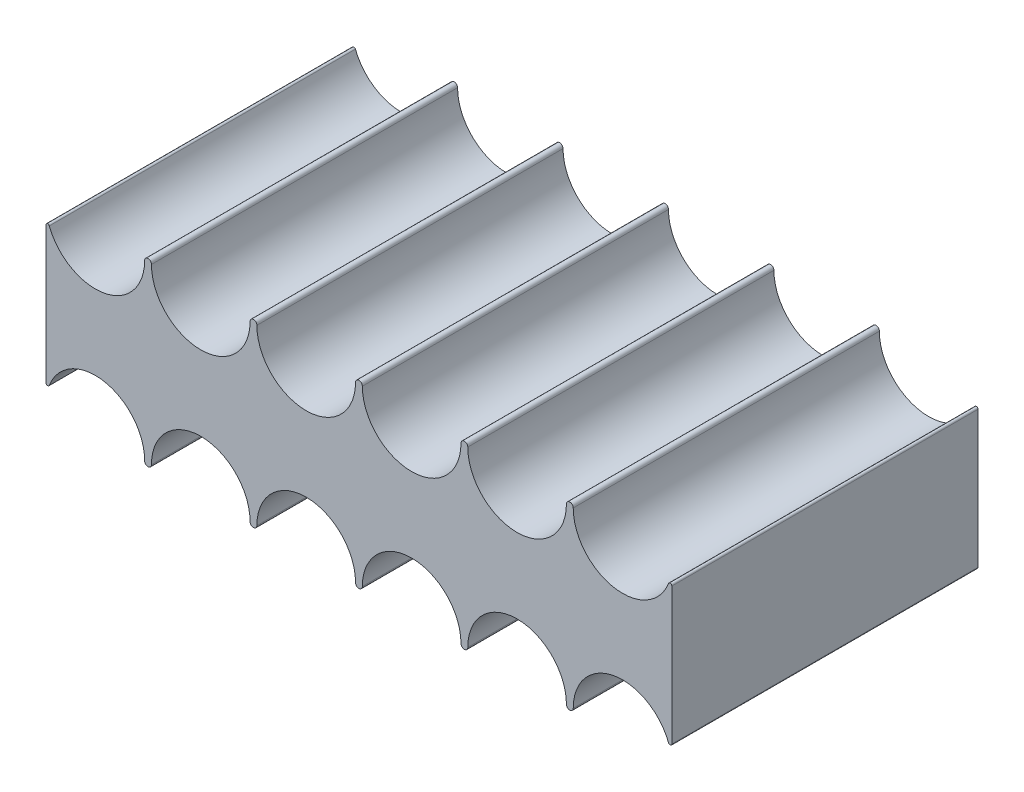
ISO-10303-21;
HEADER;
FILE_DESCRIPTION(('STEP AP214'),'2;1');
FILE_NAME('part.step','',(''),(''),'','','');
FILE_SCHEMA(('AUTOMOTIVE_DESIGN { 1 0 10303 214 1 1 1 1 }'));
ENDSEC;
DATA;
#1=APPLICATION_CONTEXT('core data for automotive mechanical design processes');
#2=APPLICATION_PROTOCOL_DEFINITION('international standard','automotive_design',2000,#1);
#3=PRODUCT_CONTEXT('',#1,'mechanical');
#4=PRODUCT('Part','Part','',(#3));
#5=PRODUCT_RELATED_PRODUCT_CATEGORY('part','',(#4));
#6=PRODUCT_DEFINITION_FORMATION('','',#4);
#7=PRODUCT_DEFINITION_CONTEXT('part definition',#1,'design');
#8=PRODUCT_DEFINITION('design','',#6,#7);
#9=PRODUCT_DEFINITION_SHAPE('','',#8);
#10=(LENGTH_UNIT() NAMED_UNIT(*) SI_UNIT(.MILLI.,.METRE.));
#11=(NAMED_UNIT(*) PLANE_ANGLE_UNIT() SI_UNIT($,.RADIAN.));
#12=(NAMED_UNIT(*) SI_UNIT($,.STERADIAN.) SOLID_ANGLE_UNIT());
#13=UNCERTAINTY_MEASURE_WITH_UNIT(LENGTH_MEASURE(1.E-05),#10,'distance_accuracy_value','');
#14=(GEOMETRIC_REPRESENTATION_CONTEXT(3) GLOBAL_UNCERTAINTY_ASSIGNED_CONTEXT((#13)) GLOBAL_UNIT_ASSIGNED_CONTEXT((#10,
#11,#12)) REPRESENTATION_CONTEXT('',''));
#15=CARTESIAN_POINT('',(0.,0.,0.));
#16=DIRECTION('',(0.,0.,1.));
#17=DIRECTION('',(1.,0.,0.));
#18=AXIS2_PLACEMENT_3D('',#15,#16,#17);
#19=CARTESIAN_POINT('',(-31.,12.75,45.));
#20=DIRECTION('',(0.,0.,-1.));
#21=DIRECTION('',(-1.,0.,0.));
#22=AXIS2_PLACEMENT_3D('',#19,#20,#21);
#23=CYLINDRICAL_SURFACE('',#22,0.5);
#24=CARTESIAN_POINT('',(-31.,12.75,0.));
#25=DIRECTION('',(0.,0.,1.));
#26=DIRECTION('',(-1.,0.,0.));
#27=AXIS2_PLACEMENT_3D('',#24,#25,#26);
#28=CIRCLE('',#27,0.5);
#29=CARTESIAN_POINT('',(-30.5,12.75,0.));
#30=VERTEX_POINT('',#29);
#31=CARTESIAN_POINT('',(-31.5,12.75,0.));
#32=VERTEX_POINT('',#31);
#33=EDGE_CURVE('E270',#30,#32,#28,.T.);
#34=ORIENTED_EDGE('',*,*,#33,.T.);
#35=DIRECTION('',(0.,0.,-1.));
#36=VECTOR('',#35,1.);
#37=CARTESIAN_POINT('',(-31.5,12.75,45.));
#38=LINE('',#37,#36);
#39=CARTESIAN_POINT('',(-31.5,12.75,45.));
#40=VERTEX_POINT('',#39);
#41=EDGE_CURVE('E11',#40,#32,#38,.T.);
#42=ORIENTED_EDGE('',*,*,#41,.F.);
#43=CARTESIAN_POINT('',(-31.,12.75,45.));
#44=DIRECTION('',(0.,0.,1.));
#45=DIRECTION('',(-1.,0.,0.));
#46=AXIS2_PLACEMENT_3D('',#43,#44,#45);
#47=CIRCLE('',#46,0.5);
#48=CARTESIAN_POINT('',(-30.5,12.75,45.));
#49=VERTEX_POINT('',#48);
#50=EDGE_CURVE('E352',#49,#40,#47,.T.);
#51=ORIENTED_EDGE('',*,*,#50,.F.);
#52=DIRECTION('',(0.,0.,-1.));
#53=VECTOR('',#52,1.);
#54=CARTESIAN_POINT('',(-30.5,12.75,45.));
#55=LINE('',#54,#53);
#56=EDGE_CURVE('E266',#49,#30,#55,.T.);
#57=ORIENTED_EDGE('',*,*,#56,.T.);
#58=EDGE_LOOP('',(#34,#42,#51,#57));
#59=FACE_BOUND('',#58,.T.);
#60=ADVANCED_FACE('F49',(#59),#23,.T.);
#61=CARTESIAN_POINT('',(-38.75,12.75,45.));
#62=DIRECTION('',(0.,0.,-1.));
#63=DIRECTION('',(-1.,0.,0.));
#64=AXIS2_PLACEMENT_3D('',#61,#62,#63);
#65=CYLINDRICAL_SURFACE('',#64,7.25);
#66=CARTESIAN_POINT('',(-38.75,12.75,0.));
#67=DIRECTION('',(0.,0.,-1.));
#68=DIRECTION('',(1.,0.,0.));
#69=AXIS2_PLACEMENT_3D('',#66,#67,#68);
#70=CIRCLE('',#69,7.25);
#71=CARTESIAN_POINT('',(-45.5166666666667,10.1471703432183,0.));
#72=VERTEX_POINT('',#71);
#73=EDGE_CURVE('E274',#32,#72,#70,.T.);
#74=ORIENTED_EDGE('',*,*,#73,.T.);
#75=DIRECTION('',(0.,0.,-1.));
#76=VECTOR('',#75,1.);
#77=CARTESIAN_POINT('',(-45.5166666666667,10.1471703432183,45.));
#78=LINE('',#77,#76);
#79=CARTESIAN_POINT('',(-45.5166666666667,10.1471703432183,45.));
#80=VERTEX_POINT('',#79);
#81=EDGE_CURVE('E58',#80,#72,#78,.T.);
#82=ORIENTED_EDGE('',*,*,#81,.F.);
#83=CARTESIAN_POINT('',(-38.75,12.75,45.));
#84=DIRECTION('',(0.,0.,-1.));
#85=DIRECTION('',(1.,0.,0.));
#86=AXIS2_PLACEMENT_3D('',#83,#84,#85);
#87=CIRCLE('',#86,7.25);
#88=EDGE_CURVE('E169',#40,#80,#87,.T.);
#89=ORIENTED_EDGE('',*,*,#88,.F.);
#90=ORIENTED_EDGE('',*,*,#41,.T.);
#91=EDGE_LOOP('',(#74,#82,#89,#90));
#92=FACE_BOUND('',#91,.T.);
#93=ADVANCED_FACE('F558',(#92),#65,.F.);
#94=CARTESIAN_POINT('',(-45.75,10.0574175964327,45.));
#95=DIRECTION('',(0.,0.,-1.));
#96=DIRECTION('',(-1.,0.,0.));
#97=AXIS2_PLACEMENT_3D('',#94,#95,#96);
#98=CYLINDRICAL_SURFACE('',#97,0.250000000000001);
#99=CARTESIAN_POINT('',(-45.75,10.0574175964327,0.));
#100=DIRECTION('',(0.,0.,1.));
#101=DIRECTION('',(1.,0.,0.));
#102=AXIS2_PLACEMENT_3D('',#99,#100,#101);
#103=CIRCLE('',#102,0.250000000000001);
#104=CARTESIAN_POINT('',(-46.,10.0574175964327,0.));
#105=VERTEX_POINT('',#104);
#106=EDGE_CURVE('E277',#72,#105,#103,.T.);
#107=ORIENTED_EDGE('',*,*,#106,.T.);
#108=DIRECTION('',(0.,0.,-1.));
#109=VECTOR('',#108,1.);
#110=CARTESIAN_POINT('',(-46.,10.0574175964327,45.));
#111=LINE('',#110,#109);
#112=CARTESIAN_POINT('',(-46.,10.0574175964327,45.));
#113=VERTEX_POINT('',#112);
#114=EDGE_CURVE('E443',#113,#105,#111,.T.);
#115=ORIENTED_EDGE('',*,*,#114,.F.);
#116=CARTESIAN_POINT('',(-45.75,10.0574175964327,45.));
#117=DIRECTION('',(0.,0.,1.));
#118=DIRECTION('',(1.,0.,0.));
#119=AXIS2_PLACEMENT_3D('',#116,#117,#118);
#120=CIRCLE('',#119,0.250000000000001);
#121=EDGE_CURVE('E453',#80,#113,#120,.T.);
#122=ORIENTED_EDGE('',*,*,#121,.F.);
#123=ORIENTED_EDGE('',*,*,#81,.T.);
#124=EDGE_LOOP('',(#107,#115,#122,#123));
#125=FACE_BOUND('',#124,.T.);
#126=ADVANCED_FACE('F451',(#125),#98,.T.);
#127=CARTESIAN_POINT('',(-46.,10.0574175964327,45.));
#128=DIRECTION('',(1.,0.,0.));
#129=DIRECTION('',(0.,1.,0.));
#130=AXIS2_PLACEMENT_3D('',#127,#128,#129);
#131=PLANE('',#130);
#132=DIRECTION('',(0.,-1.,0.));
#133=VECTOR('',#132,1.);
#134=CARTESIAN_POINT('',(-46.,10.0574175964327,0.));
#135=LINE('',#134,#133);
#136=CARTESIAN_POINT('',(-46.,-10.0574175964327,0.));
#137=VERTEX_POINT('',#136);
#138=EDGE_CURVE('E280',#105,#137,#135,.T.);
#139=ORIENTED_EDGE('',*,*,#138,.T.);
#140=DIRECTION('',(0.,0.,-1.));
#141=VECTOR('',#140,1.);
#142=CARTESIAN_POINT('',(-46.,-10.0574175964327,45.));
#143=LINE('',#142,#141);
#144=CARTESIAN_POINT('',(-46.,-10.0574175964327,45.));
#145=VERTEX_POINT('',#144);
#146=EDGE_CURVE('E439',#145,#137,#143,.T.);
#147=ORIENTED_EDGE('',*,*,#146,.F.);
#148=DIRECTION('',(0.,-1.,0.));
#149=VECTOR('',#148,1.);
#150=CARTESIAN_POINT('',(-46.,10.0574175964327,45.));
#151=LINE('',#150,#149);
#152=EDGE_CURVE('E472',#113,#145,#151,.T.);
#153=ORIENTED_EDGE('',*,*,#152,.F.);
#154=ORIENTED_EDGE('',*,*,#114,.T.);
#155=EDGE_LOOP('',(#139,#147,#153,#154));
#156=FACE_BOUND('',#155,.T.);
#157=ADVANCED_FACE('F462',(#156),#131,.F.);
#158=CARTESIAN_POINT('',(-45.75,-10.0574175964327,45.));
#159=DIRECTION('',(0.,0.,-1.));
#160=DIRECTION('',(-1.,0.,0.));
#161=AXIS2_PLACEMENT_3D('',#158,#159,#160);
#162=CYLINDRICAL_SURFACE('',#161,0.250000000000001);
#163=CARTESIAN_POINT('',(-45.75,-10.0574175964327,0.));
#164=DIRECTION('',(0.,0.,1.));
#165=DIRECTION('',(-1.,0.,0.));
#166=AXIS2_PLACEMENT_3D('',#163,#164,#165);
#167=CIRCLE('',#166,0.250000000000001);
#168=CARTESIAN_POINT('',(-45.5166666666667,-10.1471703432183,0.));
#169=VERTEX_POINT('',#168);
#170=EDGE_CURVE('E283',#137,#169,#167,.T.);
#171=ORIENTED_EDGE('',*,*,#170,.T.);
#172=DIRECTION('',(0.,0.,-1.));
#173=VECTOR('',#172,1.);
#174=CARTESIAN_POINT('',(-45.5166666666667,-10.1471703432183,45.));
#175=LINE('',#174,#173);
#176=CARTESIAN_POINT('',(-45.5166666666667,-10.1471703432183,45.));
#177=VERTEX_POINT('',#176);
#178=EDGE_CURVE('E435',#177,#169,#175,.T.);
#179=ORIENTED_EDGE('',*,*,#178,.F.);
#180=CARTESIAN_POINT('',(-45.75,-10.0574175964327,45.));
#181=DIRECTION('',(0.,0.,1.));
#182=DIRECTION('',(-1.,0.,0.));
#183=AXIS2_PLACEMENT_3D('',#180,#181,#182);
#184=CIRCLE('',#183,0.250000000000001);
#185=EDGE_CURVE('E468',#145,#177,#184,.T.);
#186=ORIENTED_EDGE('',*,*,#185,.F.);
#187=ORIENTED_EDGE('',*,*,#146,.T.);
#188=EDGE_LOOP('',(#171,#179,#186,#187));
#189=FACE_BOUND('',#188,.T.);
#190=ADVANCED_FACE('F466',(#189),#162,.T.);
#191=CARTESIAN_POINT('',(-38.75,-12.75,45.));
#192=DIRECTION('',(0.,0.,-1.));
#193=DIRECTION('',(-1.,0.,0.));
#194=AXIS2_PLACEMENT_3D('',#191,#192,#193);
#195=CYLINDRICAL_SURFACE('',#194,7.24999999999999);
#196=CARTESIAN_POINT('',(-38.75,-12.75,0.));
#197=DIRECTION('',(0.,0.,-1.));
#198=DIRECTION('',(-1.,0.,0.));
#199=AXIS2_PLACEMENT_3D('',#196,#197,#198);
#200=CIRCLE('',#199,7.24999999999999);
#201=CARTESIAN_POINT('',(-31.5,-12.75,0.));
#202=VERTEX_POINT('',#201);
#203=EDGE_CURVE('E286',#169,#202,#200,.T.);
#204=ORIENTED_EDGE('',*,*,#203,.T.);
#205=DIRECTION('',(0.,0.,-1.));
#206=VECTOR('',#205,1.);
#207=CARTESIAN_POINT('',(-31.5,-12.75,45.));
#208=LINE('',#207,#206);
#209=CARTESIAN_POINT('',(-31.5,-12.75,45.));
#210=VERTEX_POINT('',#209);
#211=EDGE_CURVE('E431',#210,#202,#208,.T.);
#212=ORIENTED_EDGE('',*,*,#211,.F.);
#213=CARTESIAN_POINT('',(-38.75,-12.75,45.));
#214=DIRECTION('',(0.,0.,-1.));
#215=DIRECTION('',(-1.,0.,0.));
#216=AXIS2_PLACEMENT_3D('',#213,#214,#215);
#217=CIRCLE('',#216,7.24999999999999);
#218=EDGE_CURVE('E471',#177,#210,#217,.T.);
#219=ORIENTED_EDGE('',*,*,#218,.F.);
#220=ORIENTED_EDGE('',*,*,#178,.T.);
#221=EDGE_LOOP('',(#204,#212,#219,#220));
#222=FACE_BOUND('',#221,.T.);
#223=ADVANCED_FACE('F571',(#222),#195,.F.);
#224=CARTESIAN_POINT('',(-31.,-12.75,45.));
#225=DIRECTION('',(0.,0.,-1.));
#226=DIRECTION('',(-1.,0.,0.));
#227=AXIS2_PLACEMENT_3D('',#224,#225,#226);
#228=CYLINDRICAL_SURFACE('',#227,0.500000000000002);
#229=CARTESIAN_POINT('',(-31.,-12.75,0.));
#230=DIRECTION('',(0.,0.,1.));
#231=DIRECTION('',(1.,0.,0.));
#232=AXIS2_PLACEMENT_3D('',#229,#230,#231);
#233=CIRCLE('',#232,0.500000000000002);
#234=CARTESIAN_POINT('',(-30.5,-12.75,0.));
#235=VERTEX_POINT('',#234);
#236=EDGE_CURVE('E289',#202,#235,#233,.T.);
#237=ORIENTED_EDGE('',*,*,#236,.T.);
#238=DIRECTION('',(0.,0.,-1.));
#239=VECTOR('',#238,1.);
#240=CARTESIAN_POINT('',(-30.5,-12.75,45.));
#241=LINE('',#240,#239);
#242=CARTESIAN_POINT('',(-30.5,-12.75,45.));
#243=VERTEX_POINT('',#242);
#244=EDGE_CURVE('E427',#243,#235,#241,.T.);
#245=ORIENTED_EDGE('',*,*,#244,.F.);
#246=CARTESIAN_POINT('',(-31.,-12.75,45.));
#247=DIRECTION('',(0.,0.,1.));
#248=DIRECTION('',(1.,0.,0.));
#249=AXIS2_PLACEMENT_3D('',#246,#247,#248);
#250=CIRCLE('',#249,0.500000000000002);
#251=EDGE_CURVE('E476',#210,#243,#250,.T.);
#252=ORIENTED_EDGE('',*,*,#251,.F.);
#253=ORIENTED_EDGE('',*,*,#211,.T.);
#254=EDGE_LOOP('',(#237,#245,#252,#253));
#255=FACE_BOUND('',#254,.T.);
#256=ADVANCED_FACE('F574',(#255),#228,.T.);
#257=CARTESIAN_POINT('',(-23.25,-12.75,45.));
#258=DIRECTION('',(0.,0.,-1.));
#259=DIRECTION('',(-1.,0.,0.));
#260=AXIS2_PLACEMENT_3D('',#257,#258,#259);
#261=CYLINDRICAL_SURFACE('',#260,7.25);
#262=CARTESIAN_POINT('',(-23.25,-12.75,0.));
#263=DIRECTION('',(0.,0.,-1.));
#264=DIRECTION('',(-1.,0.,0.));
#265=AXIS2_PLACEMENT_3D('',#262,#263,#264);
#266=CIRCLE('',#265,7.25);
#267=CARTESIAN_POINT('',(-16.,-12.75,0.));
#268=VERTEX_POINT('',#267);
#269=EDGE_CURVE('E292',#235,#268,#266,.T.);
#270=ORIENTED_EDGE('',*,*,#269,.T.);
#271=DIRECTION('',(0.,0.,-1.));
#272=VECTOR('',#271,1.);
#273=CARTESIAN_POINT('',(-16.,-12.75,45.));
#274=LINE('',#273,#272);
#275=CARTESIAN_POINT('',(-16.,-12.75,45.));
#276=VERTEX_POINT('',#275);
#277=EDGE_CURVE('E423',#276,#268,#274,.T.);
#278=ORIENTED_EDGE('',*,*,#277,.F.);
#279=CARTESIAN_POINT('',(-23.25,-12.75,45.));
#280=DIRECTION('',(0.,0.,-1.));
#281=DIRECTION('',(-1.,0.,0.));
#282=AXIS2_PLACEMENT_3D('',#279,#280,#281);
#283=CIRCLE('',#282,7.25);
#284=EDGE_CURVE('E483',#243,#276,#283,.T.);
#285=ORIENTED_EDGE('',*,*,#284,.F.);
#286=ORIENTED_EDGE('',*,*,#244,.T.);
#287=EDGE_LOOP('',(#270,#278,#285,#286));
#288=FACE_BOUND('',#287,.T.);
#289=ADVANCED_FACE('F578',(#288),#261,.F.);
#290=CARTESIAN_POINT('',(-15.5,-12.75,45.));
#291=DIRECTION('',(0.,0.,-1.));
#292=DIRECTION('',(-1.,0.,0.));
#293=AXIS2_PLACEMENT_3D('',#290,#291,#292);
#294=CYLINDRICAL_SURFACE('',#293,0.5);
#295=CARTESIAN_POINT('',(-15.5,-12.75,0.));
#296=DIRECTION('',(0.,0.,1.));
#297=DIRECTION('',(1.,0.,0.));
#298=AXIS2_PLACEMENT_3D('',#295,#296,#297);
#299=CIRCLE('',#298,0.5);
#300=CARTESIAN_POINT('',(-15.,-12.75,0.));
#301=VERTEX_POINT('',#300);
#302=EDGE_CURVE('E295',#268,#301,#299,.T.);
#303=ORIENTED_EDGE('',*,*,#302,.T.);
#304=DIRECTION('',(0.,0.,-1.));
#305=VECTOR('',#304,1.);
#306=CARTESIAN_POINT('',(-15.,-12.75,45.));
#307=LINE('',#306,#305);
#308=CARTESIAN_POINT('',(-15.,-12.75,45.));
#309=VERTEX_POINT('',#308);
#310=EDGE_CURVE('E419',#309,#301,#307,.T.);
#311=ORIENTED_EDGE('',*,*,#310,.F.);
#312=CARTESIAN_POINT('',(-15.5,-12.75,45.));
#313=DIRECTION('',(0.,0.,1.));
#314=DIRECTION('',(1.,0.,0.));
#315=AXIS2_PLACEMENT_3D('',#312,#313,#314);
#316=CIRCLE('',#315,0.5);
#317=EDGE_CURVE('E486',#276,#309,#316,.T.);
#318=ORIENTED_EDGE('',*,*,#317,.F.);
#319=ORIENTED_EDGE('',*,*,#277,.T.);
#320=EDGE_LOOP('',(#303,#311,#318,#319));
#321=FACE_BOUND('',#320,.T.);
#322=ADVANCED_FACE('F582',(#321),#294,.T.);
#323=CARTESIAN_POINT('',(-7.75,-12.75,45.));
#324=DIRECTION('',(0.,0.,-1.));
#325=DIRECTION('',(-1.,0.,0.));
#326=AXIS2_PLACEMENT_3D('',#323,#324,#325);
#327=CYLINDRICAL_SURFACE('',#326,7.25);
#328=CARTESIAN_POINT('',(-7.75,-12.75,0.));
#329=DIRECTION('',(0.,0.,-1.));
#330=DIRECTION('',(-1.,0.,0.));
#331=AXIS2_PLACEMENT_3D('',#328,#329,#330);
#332=CIRCLE('',#331,7.25);
#333=CARTESIAN_POINT('',(-0.500000000000004,-12.75,0.));
#334=VERTEX_POINT('',#333);
#335=EDGE_CURVE('E298',#301,#334,#332,.T.);
#336=ORIENTED_EDGE('',*,*,#335,.T.);
#337=DIRECTION('',(0.,0.,-1.));
#338=VECTOR('',#337,1.);
#339=CARTESIAN_POINT('',(-0.500000000000004,-12.75,45.));
#340=LINE('',#339,#338);
#341=CARTESIAN_POINT('',(-0.500000000000004,-12.75,45.));
#342=VERTEX_POINT('',#341);
#343=EDGE_CURVE('E415',#342,#334,#340,.T.);
#344=ORIENTED_EDGE('',*,*,#343,.F.);
#345=CARTESIAN_POINT('',(-7.75,-12.75,45.));
#346=DIRECTION('',(0.,0.,-1.));
#347=DIRECTION('',(-1.,0.,0.));
#348=AXIS2_PLACEMENT_3D('',#345,#346,#347);
#349=CIRCLE('',#348,7.25);
#350=EDGE_CURVE('E489',#309,#342,#349,.T.);
#351=ORIENTED_EDGE('',*,*,#350,.F.);
#352=ORIENTED_EDGE('',*,*,#310,.T.);
#353=EDGE_LOOP('',(#336,#344,#351,#352));
#354=FACE_BOUND('',#353,.T.);
#355=ADVANCED_FACE('F586',(#354),#327,.F.);
#356=CARTESIAN_POINT('',(0.,-12.75,45.));
#357=DIRECTION('',(0.,0.,-1.));
#358=DIRECTION('',(-1.,0.,0.));
#359=AXIS2_PLACEMENT_3D('',#356,#357,#358);
#360=CYLINDRICAL_SURFACE('',#359,0.5);
#361=CARTESIAN_POINT('',(0.,-12.75,0.));
#362=DIRECTION('',(0.,0.,1.));
#363=DIRECTION('',(1.,0.,0.));
#364=AXIS2_PLACEMENT_3D('',#361,#362,#363);
#365=CIRCLE('',#364,0.5);
#366=CARTESIAN_POINT('',(0.5,-12.75,0.));
#367=VERTEX_POINT('',#366);
#368=EDGE_CURVE('E301',#334,#367,#365,.T.);
#369=ORIENTED_EDGE('',*,*,#368,.T.);
#370=DIRECTION('',(0.,0.,-1.));
#371=VECTOR('',#370,1.);
#372=CARTESIAN_POINT('',(0.5,-12.75,45.));
#373=LINE('',#372,#371);
#374=CARTESIAN_POINT('',(0.5,-12.75,45.));
#375=VERTEX_POINT('',#374);
#376=EDGE_CURVE('E411',#375,#367,#373,.T.);
#377=ORIENTED_EDGE('',*,*,#376,.F.);
#378=CARTESIAN_POINT('',(0.,-12.75,45.));
#379=DIRECTION('',(0.,0.,1.));
#380=DIRECTION('',(1.,0.,0.));
#381=AXIS2_PLACEMENT_3D('',#378,#379,#380);
#382=CIRCLE('',#381,0.5);
#383=EDGE_CURVE('E492',#342,#375,#382,.T.);
#384=ORIENTED_EDGE('',*,*,#383,.F.);
#385=ORIENTED_EDGE('',*,*,#343,.T.);
#386=EDGE_LOOP('',(#369,#377,#384,#385));
#387=FACE_BOUND('',#386,.T.);
#388=ADVANCED_FACE('F590',(#387),#360,.T.);
#389=CARTESIAN_POINT('',(7.75,-12.75,45.));
#390=DIRECTION('',(0.,0.,-1.));
#391=DIRECTION('',(-1.,0.,0.));
#392=AXIS2_PLACEMENT_3D('',#389,#390,#391);
#393=CYLINDRICAL_SURFACE('',#392,7.25);
#394=CARTESIAN_POINT('',(7.75,-12.75,0.));
#395=DIRECTION('',(0.,0.,-1.));
#396=DIRECTION('',(-1.,0.,0.));
#397=AXIS2_PLACEMENT_3D('',#394,#395,#396);
#398=CIRCLE('',#397,7.25);
#399=CARTESIAN_POINT('',(15.,-12.75,0.));
#400=VERTEX_POINT('',#399);
#401=EDGE_CURVE('E304',#367,#400,#398,.T.);
#402=ORIENTED_EDGE('',*,*,#401,.T.);
#403=DIRECTION('',(0.,0.,-1.));
#404=VECTOR('',#403,1.);
#405=CARTESIAN_POINT('',(15.,-12.75,45.));
#406=LINE('',#405,#404);
#407=CARTESIAN_POINT('',(15.,-12.75,45.));
#408=VERTEX_POINT('',#407);
#409=EDGE_CURVE('E407',#408,#400,#406,.T.);
#410=ORIENTED_EDGE('',*,*,#409,.F.);
#411=CARTESIAN_POINT('',(7.75,-12.75,45.));
#412=DIRECTION('',(0.,0.,-1.));
#413=DIRECTION('',(-1.,0.,0.));
#414=AXIS2_PLACEMENT_3D('',#411,#412,#413);
#415=CIRCLE('',#414,7.25);
#416=EDGE_CURVE('E495',#375,#408,#415,.T.);
#417=ORIENTED_EDGE('',*,*,#416,.F.);
#418=ORIENTED_EDGE('',*,*,#376,.T.);
#419=EDGE_LOOP('',(#402,#410,#417,#418));
#420=FACE_BOUND('',#419,.T.);
#421=ADVANCED_FACE('F594',(#420),#393,.F.);
#422=CARTESIAN_POINT('',(15.5,-12.75,45.));
#423=DIRECTION('',(0.,0.,-1.));
#424=DIRECTION('',(-1.,0.,0.));
#425=AXIS2_PLACEMENT_3D('',#422,#423,#424);
#426=CYLINDRICAL_SURFACE('',#425,0.5);
#427=CARTESIAN_POINT('',(15.5,-12.75,0.));
#428=DIRECTION('',(0.,0.,1.));
#429=DIRECTION('',(1.,0.,0.));
#430=AXIS2_PLACEMENT_3D('',#427,#428,#429);
#431=CIRCLE('',#430,0.5);
#432=CARTESIAN_POINT('',(16.,-12.75,0.));
#433=VERTEX_POINT('',#432);
#434=EDGE_CURVE('E307',#400,#433,#431,.T.);
#435=ORIENTED_EDGE('',*,*,#434,.T.);
#436=DIRECTION('',(0.,0.,-1.));
#437=VECTOR('',#436,1.);
#438=CARTESIAN_POINT('',(16.,-12.75,45.));
#439=LINE('',#438,#437);
#440=CARTESIAN_POINT('',(16.,-12.75,45.));
#441=VERTEX_POINT('',#440);
#442=EDGE_CURVE('E403',#441,#433,#439,.T.);
#443=ORIENTED_EDGE('',*,*,#442,.F.);
#444=CARTESIAN_POINT('',(15.5,-12.75,45.));
#445=DIRECTION('',(0.,0.,1.));
#446=DIRECTION('',(1.,0.,0.));
#447=AXIS2_PLACEMENT_3D('',#444,#445,#446);
#448=CIRCLE('',#447,0.5);
#449=EDGE_CURVE('E498',#408,#441,#448,.T.);
#450=ORIENTED_EDGE('',*,*,#449,.F.);
#451=ORIENTED_EDGE('',*,*,#409,.T.);
#452=EDGE_LOOP('',(#435,#443,#450,#451));
#453=FACE_BOUND('',#452,.T.);
#454=ADVANCED_FACE('F598',(#453),#426,.T.);
#455=CARTESIAN_POINT('',(23.25,-12.75,45.));
#456=DIRECTION('',(0.,0.,-1.));
#457=DIRECTION('',(-1.,0.,0.));
#458=AXIS2_PLACEMENT_3D('',#455,#456,#457);
#459=CYLINDRICAL_SURFACE('',#458,7.25);
#460=CARTESIAN_POINT('',(23.25,-12.75,0.));
#461=DIRECTION('',(0.,0.,-1.));
#462=DIRECTION('',(-1.,0.,0.));
#463=AXIS2_PLACEMENT_3D('',#460,#461,#462);
#464=CIRCLE('',#463,7.25);
#465=CARTESIAN_POINT('',(30.5,-12.75,0.));
#466=VERTEX_POINT('',#465);
#467=EDGE_CURVE('E310',#433,#466,#464,.T.);
#468=ORIENTED_EDGE('',*,*,#467,.T.);
#469=DIRECTION('',(0.,0.,-1.));
#470=VECTOR('',#469,1.);
#471=CARTESIAN_POINT('',(30.5,-12.75,45.));
#472=LINE('',#471,#470);
#473=CARTESIAN_POINT('',(30.5,-12.75,45.));
#474=VERTEX_POINT('',#473);
#475=EDGE_CURVE('E399',#474,#466,#472,.T.);
#476=ORIENTED_EDGE('',*,*,#475,.F.);
#477=CARTESIAN_POINT('',(23.25,-12.75,45.));
#478=DIRECTION('',(0.,0.,-1.));
#479=DIRECTION('',(-1.,0.,0.));
#480=AXIS2_PLACEMENT_3D('',#477,#478,#479);
#481=CIRCLE('',#480,7.25);
#482=EDGE_CURVE('E501',#441,#474,#481,.T.);
#483=ORIENTED_EDGE('',*,*,#482,.F.);
#484=ORIENTED_EDGE('',*,*,#442,.T.);
#485=EDGE_LOOP('',(#468,#476,#483,#484));
#486=FACE_BOUND('',#485,.T.);
#487=ADVANCED_FACE('F602',(#486),#459,.F.);
#488=CARTESIAN_POINT('',(31.,-12.75,45.));
#489=DIRECTION('',(0.,0.,-1.));
#490=DIRECTION('',(-1.,0.,0.));
#491=AXIS2_PLACEMENT_3D('',#488,#489,#490);
#492=CYLINDRICAL_SURFACE('',#491,0.5);
#493=CARTESIAN_POINT('',(31.,-12.75,0.));
#494=DIRECTION('',(0.,0.,1.));
#495=DIRECTION('',(1.,0.,0.));
#496=AXIS2_PLACEMENT_3D('',#493,#494,#495);
#497=CIRCLE('',#496,0.5);
#498=CARTESIAN_POINT('',(31.5,-12.75,0.));
#499=VERTEX_POINT('',#498);
#500=EDGE_CURVE('E313',#466,#499,#497,.T.);
#501=ORIENTED_EDGE('',*,*,#500,.T.);
#502=DIRECTION('',(0.,0.,-1.));
#503=VECTOR('',#502,1.);
#504=CARTESIAN_POINT('',(31.5,-12.75,45.));
#505=LINE('',#504,#503);
#506=CARTESIAN_POINT('',(31.5,-12.75,45.));
#507=VERTEX_POINT('',#506);
#508=EDGE_CURVE('E395',#507,#499,#505,.T.);
#509=ORIENTED_EDGE('',*,*,#508,.F.);
#510=CARTESIAN_POINT('',(31.,-12.75,45.));
#511=DIRECTION('',(0.,0.,1.));
#512=DIRECTION('',(1.,0.,0.));
#513=AXIS2_PLACEMENT_3D('',#510,#511,#512);
#514=CIRCLE('',#513,0.5);
#515=EDGE_CURVE('E504',#474,#507,#514,.T.);
#516=ORIENTED_EDGE('',*,*,#515,.F.);
#517=ORIENTED_EDGE('',*,*,#475,.T.);
#518=EDGE_LOOP('',(#501,#509,#516,#517));
#519=FACE_BOUND('',#518,.T.);
#520=ADVANCED_FACE('F606',(#519),#492,.T.);
#521=CARTESIAN_POINT('',(38.75,-12.75,45.));
#522=DIRECTION('',(0.,0.,-1.));
#523=DIRECTION('',(-1.,0.,0.));
#524=AXIS2_PLACEMENT_3D('',#521,#522,#523);
#525=CYLINDRICAL_SURFACE('',#524,7.25);
#526=CARTESIAN_POINT('',(38.75,-12.75,0.));
#527=DIRECTION('',(0.,0.,-1.));
#528=DIRECTION('',(-1.,0.,0.));
#529=AXIS2_PLACEMENT_3D('',#526,#527,#528);
#530=CIRCLE('',#529,7.25);
#531=CARTESIAN_POINT('',(45.5166666666667,-10.1471703432183,0.));
#532=VERTEX_POINT('',#531);
#533=EDGE_CURVE('E316',#499,#532,#530,.T.);
#534=ORIENTED_EDGE('',*,*,#533,.T.);
#535=DIRECTION('',(0.,0.,-1.));
#536=VECTOR('',#535,1.);
#537=CARTESIAN_POINT('',(45.5166666666667,-10.1471703432183,45.));
#538=LINE('',#537,#536);
#539=CARTESIAN_POINT('',(45.5166666666667,-10.1471703432183,45.));
#540=VERTEX_POINT('',#539);
#541=EDGE_CURVE('E391',#540,#532,#538,.T.);
#542=ORIENTED_EDGE('',*,*,#541,.F.);
#543=CARTESIAN_POINT('',(38.75,-12.75,45.));
#544=DIRECTION('',(0.,0.,-1.));
#545=DIRECTION('',(-1.,0.,0.));
#546=AXIS2_PLACEMENT_3D('',#543,#544,#545);
#547=CIRCLE('',#546,7.25);
#548=EDGE_CURVE('E507',#507,#540,#547,.T.);
#549=ORIENTED_EDGE('',*,*,#548,.F.);
#550=ORIENTED_EDGE('',*,*,#508,.T.);
#551=EDGE_LOOP('',(#534,#542,#549,#550));
#552=FACE_BOUND('',#551,.T.);
#553=ADVANCED_FACE('F610',(#552),#525,.F.);
#554=CARTESIAN_POINT('',(45.75,-10.0574175964327,45.));
#555=DIRECTION('',(0.,0.,-1.));
#556=DIRECTION('',(-1.,0.,0.));
#557=AXIS2_PLACEMENT_3D('',#554,#555,#556);
#558=CYLINDRICAL_SURFACE('',#557,0.250000000000001);
#559=CARTESIAN_POINT('',(45.75,-10.0574175964327,0.));
#560=DIRECTION('',(0.,0.,1.));
#561=DIRECTION('',(1.,0.,0.));
#562=AXIS2_PLACEMENT_3D('',#559,#560,#561);
#563=CIRCLE('',#562,0.250000000000001);
#564=CARTESIAN_POINT('',(46.,-10.0574175964327,0.));
#565=VERTEX_POINT('',#564);
#566=EDGE_CURVE('E319',#532,#565,#563,.T.);
#567=ORIENTED_EDGE('',*,*,#566,.T.);
#568=DIRECTION('',(0.,0.,-1.));
#569=VECTOR('',#568,1.);
#570=CARTESIAN_POINT('',(46.,-10.0574175964327,45.));
#571=LINE('',#570,#569);
#572=CARTESIAN_POINT('',(46.,-10.0574175964327,45.));
#573=VERTEX_POINT('',#572);
#574=EDGE_CURVE('E387',#573,#565,#571,.T.);
#575=ORIENTED_EDGE('',*,*,#574,.F.);
#576=CARTESIAN_POINT('',(45.75,-10.0574175964327,45.));
#577=DIRECTION('',(0.,0.,1.));
#578=DIRECTION('',(1.,0.,0.));
#579=AXIS2_PLACEMENT_3D('',#576,#577,#578);
#580=CIRCLE('',#579,0.250000000000001);
#581=EDGE_CURVE('E510',#540,#573,#580,.T.);
#582=ORIENTED_EDGE('',*,*,#581,.F.);
#583=ORIENTED_EDGE('',*,*,#541,.T.);
#584=EDGE_LOOP('',(#567,#575,#582,#583));
#585=FACE_BOUND('',#584,.T.);
#586=ADVANCED_FACE('F614',(#585),#558,.T.);
#587=CARTESIAN_POINT('',(46.,10.0574175964327,45.));
#588=DIRECTION('',(-1.,0.,0.));
#589=DIRECTION('',(0.,0.,1.));
#590=AXIS2_PLACEMENT_3D('',#587,#588,#589);
#591=PLANE('',#590);
#592=DIRECTION('',(0.,1.,0.));
#593=VECTOR('',#592,1.);
#594=CARTESIAN_POINT('',(46.,10.0574175964327,0.));
#595=LINE('',#594,#593);
#596=CARTESIAN_POINT('',(46.,10.0574175964327,0.));
#597=VERTEX_POINT('',#596);
#598=EDGE_CURVE('E322',#565,#597,#595,.T.);
#599=ORIENTED_EDGE('',*,*,#598,.T.);
#600=DIRECTION('',(0.,0.,-1.));
#601=VECTOR('',#600,1.);
#602=CARTESIAN_POINT('',(46.,10.0574175964327,45.));
#603=LINE('',#602,#601);
#604=CARTESIAN_POINT('',(46.,10.0574175964327,45.));
#605=VERTEX_POINT('',#604);
#606=EDGE_CURVE('E383',#605,#597,#603,.T.);
#607=ORIENTED_EDGE('',*,*,#606,.F.);
#608=DIRECTION('',(0.,1.,0.));
#609=VECTOR('',#608,1.);
#610=CARTESIAN_POINT('',(46.,10.0574175964327,45.));
#611=LINE('',#610,#609);
#612=EDGE_CURVE('E513',#573,#605,#611,.T.);
#613=ORIENTED_EDGE('',*,*,#612,.F.);
#614=ORIENTED_EDGE('',*,*,#574,.T.);
#615=EDGE_LOOP('',(#599,#607,#613,#614));
#616=FACE_BOUND('',#615,.T.);
#617=ADVANCED_FACE('F618',(#616),#591,.F.);
#618=CARTESIAN_POINT('',(45.75,10.0574175964327,45.));
#619=DIRECTION('',(0.,0.,-1.));
#620=DIRECTION('',(-1.,0.,0.));
#621=AXIS2_PLACEMENT_3D('',#618,#619,#620);
#622=CYLINDRICAL_SURFACE('',#621,0.250000000000001);
#623=CARTESIAN_POINT('',(45.75,10.0574175964327,0.));
#624=DIRECTION('',(0.,0.,1.));
#625=DIRECTION('',(-1.,0.,0.));
#626=AXIS2_PLACEMENT_3D('',#623,#624,#625);
#627=CIRCLE('',#626,0.250000000000001);
#628=CARTESIAN_POINT('',(45.5166666666667,10.1471703432183,0.));
#629=VERTEX_POINT('',#628);
#630=EDGE_CURVE('E325',#597,#629,#627,.T.);
#631=ORIENTED_EDGE('',*,*,#630,.T.);
#632=DIRECTION('',(0.,0.,-1.));
#633=VECTOR('',#632,1.);
#634=CARTESIAN_POINT('',(45.5166666666667,10.1471703432183,45.));
#635=LINE('',#634,#633);
#636=CARTESIAN_POINT('',(45.5166666666667,10.1471703432183,45.));
#637=VERTEX_POINT('',#636);
#638=EDGE_CURVE('E379',#637,#629,#635,.T.);
#639=ORIENTED_EDGE('',*,*,#638,.F.);
#640=CARTESIAN_POINT('',(45.75,10.0574175964327,45.));
#641=DIRECTION('',(0.,0.,1.));
#642=DIRECTION('',(-1.,0.,0.));
#643=AXIS2_PLACEMENT_3D('',#640,#641,#642);
#644=CIRCLE('',#643,0.250000000000001);
#645=EDGE_CURVE('E516',#605,#637,#644,.T.);
#646=ORIENTED_EDGE('',*,*,#645,.F.);
#647=ORIENTED_EDGE('',*,*,#606,.T.);
#648=EDGE_LOOP('',(#631,#639,#646,#647));
#649=FACE_BOUND('',#648,.T.);
#650=ADVANCED_FACE('F622',(#649),#622,.T.);
#651=CARTESIAN_POINT('',(38.75,12.75,45.));
#652=DIRECTION('',(0.,0.,-1.));
#653=DIRECTION('',(-1.,0.,0.));
#654=AXIS2_PLACEMENT_3D('',#651,#652,#653);
#655=CYLINDRICAL_SURFACE('',#654,7.25);
#656=CARTESIAN_POINT('',(38.75,12.75,0.));
#657=DIRECTION('',(0.,0.,-1.));
#658=DIRECTION('',(1.,0.,0.));
#659=AXIS2_PLACEMENT_3D('',#656,#657,#658);
#660=CIRCLE('',#659,7.25);
#661=CARTESIAN_POINT('',(31.5,12.75,0.));
#662=VERTEX_POINT('',#661);
#663=EDGE_CURVE('E328',#629,#662,#660,.T.);
#664=ORIENTED_EDGE('',*,*,#663,.T.);
#665=DIRECTION('',(0.,0.,-1.));
#666=VECTOR('',#665,1.);
#667=CARTESIAN_POINT('',(31.5,12.75,45.));
#668=LINE('',#667,#666);
#669=CARTESIAN_POINT('',(31.5,12.75,45.));
#670=VERTEX_POINT('',#669);
#671=EDGE_CURVE('E375',#670,#662,#668,.T.);
#672=ORIENTED_EDGE('',*,*,#671,.F.);
#673=CARTESIAN_POINT('',(38.75,12.75,45.));
#674=DIRECTION('',(0.,0.,-1.));
#675=DIRECTION('',(1.,0.,0.));
#676=AXIS2_PLACEMENT_3D('',#673,#674,#675);
#677=CIRCLE('',#676,7.25);
#678=EDGE_CURVE('E519',#637,#670,#677,.T.);
#679=ORIENTED_EDGE('',*,*,#678,.F.);
#680=ORIENTED_EDGE('',*,*,#638,.T.);
#681=EDGE_LOOP('',(#664,#672,#679,#680));
#682=FACE_BOUND('',#681,.T.);
#683=ADVANCED_FACE('F626',(#682),#655,.F.);
#684=CARTESIAN_POINT('',(31.,12.75,45.));
#685=DIRECTION('',(0.,0.,-1.));
#686=DIRECTION('',(-1.,0.,0.));
#687=AXIS2_PLACEMENT_3D('',#684,#685,#686);
#688=CYLINDRICAL_SURFACE('',#687,0.5);
#689=CARTESIAN_POINT('',(31.,12.75,0.));
#690=DIRECTION('',(0.,0.,1.));
#691=DIRECTION('',(-1.,0.,0.));
#692=AXIS2_PLACEMENT_3D('',#689,#690,#691);
#693=CIRCLE('',#692,0.5);
#694=CARTESIAN_POINT('',(30.5,12.75,0.));
#695=VERTEX_POINT('',#694);
#696=EDGE_CURVE('E331',#662,#695,#693,.T.);
#697=ORIENTED_EDGE('',*,*,#696,.T.);
#698=DIRECTION('',(0.,0.,-1.));
#699=VECTOR('',#698,1.);
#700=CARTESIAN_POINT('',(30.5,12.75,45.));
#701=LINE('',#700,#699);
#702=CARTESIAN_POINT('',(30.5,12.75,45.));
#703=VERTEX_POINT('',#702);
#704=EDGE_CURVE('E371',#703,#695,#701,.T.);
#705=ORIENTED_EDGE('',*,*,#704,.F.);
#706=CARTESIAN_POINT('',(31.,12.75,45.));
#707=DIRECTION('',(0.,0.,1.));
#708=DIRECTION('',(-1.,0.,0.));
#709=AXIS2_PLACEMENT_3D('',#706,#707,#708);
#710=CIRCLE('',#709,0.5);
#711=EDGE_CURVE('E522',#670,#703,#710,.T.);
#712=ORIENTED_EDGE('',*,*,#711,.F.);
#713=ORIENTED_EDGE('',*,*,#671,.T.);
#714=EDGE_LOOP('',(#697,#705,#712,#713));
#715=FACE_BOUND('',#714,.T.);
#716=ADVANCED_FACE('F630',(#715),#688,.T.);
#717=CARTESIAN_POINT('',(23.25,12.75,45.));
#718=DIRECTION('',(0.,0.,-1.));
#719=DIRECTION('',(-1.,0.,0.));
#720=AXIS2_PLACEMENT_3D('',#717,#718,#719);
#721=CYLINDRICAL_SURFACE('',#720,7.25);
#722=CARTESIAN_POINT('',(23.25,12.75,0.));
#723=DIRECTION('',(0.,0.,-1.));
#724=DIRECTION('',(1.,0.,0.));
#725=AXIS2_PLACEMENT_3D('',#722,#723,#724);
#726=CIRCLE('',#725,7.25);
#727=CARTESIAN_POINT('',(16.,12.75,0.));
#728=VERTEX_POINT('',#727);
#729=EDGE_CURVE('E334',#695,#728,#726,.T.);
#730=ORIENTED_EDGE('',*,*,#729,.T.);
#731=DIRECTION('',(0.,0.,-1.));
#732=VECTOR('',#731,1.);
#733=CARTESIAN_POINT('',(16.,12.75,45.));
#734=LINE('',#733,#732);
#735=CARTESIAN_POINT('',(16.,12.75,45.));
#736=VERTEX_POINT('',#735);
#737=EDGE_CURVE('E367',#736,#728,#734,.T.);
#738=ORIENTED_EDGE('',*,*,#737,.F.);
#739=CARTESIAN_POINT('',(23.25,12.75,45.));
#740=DIRECTION('',(0.,0.,-1.));
#741=DIRECTION('',(1.,0.,0.));
#742=AXIS2_PLACEMENT_3D('',#739,#740,#741);
#743=CIRCLE('',#742,7.25);
#744=EDGE_CURVE('E525',#703,#736,#743,.T.);
#745=ORIENTED_EDGE('',*,*,#744,.F.);
#746=ORIENTED_EDGE('',*,*,#704,.T.);
#747=EDGE_LOOP('',(#730,#738,#745,#746));
#748=FACE_BOUND('',#747,.T.);
#749=ADVANCED_FACE('F634',(#748),#721,.F.);
#750=CARTESIAN_POINT('',(15.5,12.75,45.));
#751=DIRECTION('',(0.,0.,-1.));
#752=DIRECTION('',(-1.,0.,0.));
#753=AXIS2_PLACEMENT_3D('',#750,#751,#752);
#754=CYLINDRICAL_SURFACE('',#753,0.5);
#755=CARTESIAN_POINT('',(15.5,12.75,0.));
#756=DIRECTION('',(0.,0.,1.));
#757=DIRECTION('',(-1.,0.,0.));
#758=AXIS2_PLACEMENT_3D('',#755,#756,#757);
#759=CIRCLE('',#758,0.5);
#760=CARTESIAN_POINT('',(15.,12.75,0.));
#761=VERTEX_POINT('',#760);
#762=EDGE_CURVE('E337',#728,#761,#759,.T.);
#763=ORIENTED_EDGE('',*,*,#762,.T.);
#764=DIRECTION('',(0.,0.,-1.));
#765=VECTOR('',#764,1.);
#766=CARTESIAN_POINT('',(15.,12.75,45.));
#767=LINE('',#766,#765);
#768=CARTESIAN_POINT('',(15.,12.75,45.));
#769=VERTEX_POINT('',#768);
#770=EDGE_CURVE('E363',#769,#761,#767,.T.);
#771=ORIENTED_EDGE('',*,*,#770,.F.);
#772=CARTESIAN_POINT('',(15.5,12.75,45.));
#773=DIRECTION('',(0.,0.,1.));
#774=DIRECTION('',(-1.,0.,0.));
#775=AXIS2_PLACEMENT_3D('',#772,#773,#774);
#776=CIRCLE('',#775,0.5);
#777=EDGE_CURVE('E528',#736,#769,#776,.T.);
#778=ORIENTED_EDGE('',*,*,#777,.F.);
#779=ORIENTED_EDGE('',*,*,#737,.T.);
#780=EDGE_LOOP('',(#763,#771,#778,#779));
#781=FACE_BOUND('',#780,.T.);
#782=ADVANCED_FACE('F638',(#781),#754,.T.);
#783=CARTESIAN_POINT('',(7.75,12.75,45.));
#784=DIRECTION('',(0.,0.,-1.));
#785=DIRECTION('',(-1.,0.,0.));
#786=AXIS2_PLACEMENT_3D('',#783,#784,#785);
#787=CYLINDRICAL_SURFACE('',#786,7.25);
#788=CARTESIAN_POINT('',(7.75,12.75,0.));
#789=DIRECTION('',(0.,0.,-1.));
#790=DIRECTION('',(1.,0.,0.));
#791=AXIS2_PLACEMENT_3D('',#788,#789,#790);
#792=CIRCLE('',#791,7.25);
#793=CARTESIAN_POINT('',(0.5,12.75,0.));
#794=VERTEX_POINT('',#793);
#795=EDGE_CURVE('E340',#761,#794,#792,.T.);
#796=ORIENTED_EDGE('',*,*,#795,.T.);
#797=DIRECTION('',(0.,0.,-1.));
#798=VECTOR('',#797,1.);
#799=CARTESIAN_POINT('',(0.5,12.75,45.));
#800=LINE('',#799,#798);
#801=CARTESIAN_POINT('',(0.5,12.75,45.));
#802=VERTEX_POINT('',#801);
#803=EDGE_CURVE('E359',#802,#794,#800,.T.);
#804=ORIENTED_EDGE('',*,*,#803,.F.);
#805=CARTESIAN_POINT('',(7.75,12.75,45.));
#806=DIRECTION('',(0.,0.,-1.));
#807=DIRECTION('',(1.,0.,0.));
#808=AXIS2_PLACEMENT_3D('',#805,#806,#807);
#809=CIRCLE('',#808,7.25);
#810=EDGE_CURVE('E531',#769,#802,#809,.T.);
#811=ORIENTED_EDGE('',*,*,#810,.F.);
#812=ORIENTED_EDGE('',*,*,#770,.T.);
#813=EDGE_LOOP('',(#796,#804,#811,#812));
#814=FACE_BOUND('',#813,.T.);
#815=ADVANCED_FACE('F539',(#814),#787,.F.);
#816=CARTESIAN_POINT('',(0.,12.75,45.));
#817=DIRECTION('',(0.,0.,-1.));
#818=DIRECTION('',(-1.,0.,0.));
#819=AXIS2_PLACEMENT_3D('',#816,#817,#818);
#820=CYLINDRICAL_SURFACE('',#819,0.5);
#821=CARTESIAN_POINT('',(0.,12.75,0.));
#822=DIRECTION('',(0.,0.,1.));
#823=DIRECTION('',(-1.,0.,0.));
#824=AXIS2_PLACEMENT_3D('',#821,#822,#823);
#825=CIRCLE('',#824,0.5);
#826=CARTESIAN_POINT('',(-0.5,12.75,0.));
#827=VERTEX_POINT('',#826);
#828=EDGE_CURVE('E343',#794,#827,#825,.T.);
#829=ORIENTED_EDGE('',*,*,#828,.T.);
#830=DIRECTION('',(0.,0.,-1.));
#831=VECTOR('',#830,1.);
#832=CARTESIAN_POINT('',(-0.5,12.75,45.));
#833=LINE('',#832,#831);
#834=CARTESIAN_POINT('',(-0.5,12.75,45.));
#835=VERTEX_POINT('',#834);
#836=EDGE_CURVE('E259',#835,#827,#833,.T.);
#837=ORIENTED_EDGE('',*,*,#836,.F.);
#838=CARTESIAN_POINT('',(0.,12.75,45.));
#839=DIRECTION('',(0.,0.,1.));
#840=DIRECTION('',(-1.,0.,0.));
#841=AXIS2_PLACEMENT_3D('',#838,#839,#840);
#842=CIRCLE('',#841,0.5);
#843=EDGE_CURVE('E248',#802,#835,#842,.T.);
#844=ORIENTED_EDGE('',*,*,#843,.F.);
#845=ORIENTED_EDGE('',*,*,#803,.T.);
#846=EDGE_LOOP('',(#829,#837,#844,#845));
#847=FACE_BOUND('',#846,.T.);
#848=ADVANCED_FACE('F543',(#847),#820,.T.);
#849=CARTESIAN_POINT('',(-7.75,12.75,45.));
#850=DIRECTION('',(0.,0.,-1.));
#851=DIRECTION('',(-1.,0.,0.));
#852=AXIS2_PLACEMENT_3D('',#849,#850,#851);
#853=CYLINDRICAL_SURFACE('',#852,7.25);
#854=CARTESIAN_POINT('',(-7.75,12.75,0.));
#855=DIRECTION('',(0.,0.,-1.));
#856=DIRECTION('',(1.,0.,0.));
#857=AXIS2_PLACEMENT_3D('',#854,#855,#856);
#858=CIRCLE('',#857,7.25);
#859=CARTESIAN_POINT('',(-15.,12.75,0.));
#860=VERTEX_POINT('',#859);
#861=EDGE_CURVE('E257',#827,#860,#858,.T.);
#862=ORIENTED_EDGE('',*,*,#861,.T.);
#863=DIRECTION('',(0.,0.,-1.));
#864=VECTOR('',#863,1.);
#865=CARTESIAN_POINT('',(-15.,12.75,45.));
#866=LINE('',#865,#864);
#867=CARTESIAN_POINT('',(-15.,12.75,45.));
#868=VERTEX_POINT('',#867);
#869=EDGE_CURVE('E254',#868,#860,#866,.T.);
#870=ORIENTED_EDGE('',*,*,#869,.F.);
#871=CARTESIAN_POINT('',(-7.75,12.75,45.));
#872=DIRECTION('',(0.,0.,-1.));
#873=DIRECTION('',(1.,0.,0.));
#874=AXIS2_PLACEMENT_3D('',#871,#872,#873);
#875=CIRCLE('',#874,7.25);
#876=EDGE_CURVE('E242',#835,#868,#875,.T.);
#877=ORIENTED_EDGE('',*,*,#876,.F.);
#878=ORIENTED_EDGE('',*,*,#836,.T.);
#879=EDGE_LOOP('',(#862,#870,#877,#878));
#880=FACE_BOUND('',#879,.T.);
#881=ADVANCED_FACE('F255',(#880),#853,.F.);
#882=CARTESIAN_POINT('',(-15.5,12.75,45.));
#883=DIRECTION('',(0.,0.,-1.));
#884=DIRECTION('',(-1.,0.,0.));
#885=AXIS2_PLACEMENT_3D('',#882,#883,#884);
#886=CYLINDRICAL_SURFACE('',#885,0.5);
#887=CARTESIAN_POINT('',(-15.5,12.75,0.));
#888=DIRECTION('',(0.,0.,1.));
#889=DIRECTION('',(-1.,0.,0.));
#890=AXIS2_PLACEMENT_3D('',#887,#888,#889);
#891=CIRCLE('',#890,0.5);
#892=CARTESIAN_POINT('',(-16.,12.75,0.));
#893=VERTEX_POINT('',#892);
#894=EDGE_CURVE('E155',#860,#893,#891,.T.);
#895=ORIENTED_EDGE('',*,*,#894,.T.);
#896=DIRECTION('',(0.,0.,-1.));
#897=VECTOR('',#896,1.);
#898=CARTESIAN_POINT('',(-16.,12.75,45.));
#899=LINE('',#898,#897);
#900=CARTESIAN_POINT('',(-16.,12.75,45.));
#901=VERTEX_POINT('',#900);
#902=EDGE_CURVE('E260',#901,#893,#899,.T.);
#903=ORIENTED_EDGE('',*,*,#902,.F.);
#904=CARTESIAN_POINT('',(-15.5,12.75,45.));
#905=DIRECTION('',(0.,0.,1.));
#906=DIRECTION('',(-1.,0.,0.));
#907=AXIS2_PLACEMENT_3D('',#904,#905,#906);
#908=CIRCLE('',#907,0.5);
#909=EDGE_CURVE('E246',#868,#901,#908,.T.);
#910=ORIENTED_EDGE('',*,*,#909,.F.);
#911=ORIENTED_EDGE('',*,*,#869,.T.);
#912=EDGE_LOOP('',(#895,#903,#910,#911));
#913=FACE_BOUND('',#912,.T.);
#914=ADVANCED_FACE('F262',(#913),#886,.T.);
#915=CARTESIAN_POINT('',(-23.25,12.75,45.));
#916=DIRECTION('',(0.,0.,-1.));
#917=DIRECTION('',(-1.,0.,0.));
#918=AXIS2_PLACEMENT_3D('',#915,#916,#917);
#919=CYLINDRICAL_SURFACE('',#918,7.25);
#920=CARTESIAN_POINT('',(-23.25,12.75,0.));
#921=DIRECTION('',(0.,0.,-1.));
#922=DIRECTION('',(1.,0.,0.));
#923=AXIS2_PLACEMENT_3D('',#920,#921,#922);
#924=CIRCLE('',#923,7.25);
#925=EDGE_CURVE('E161',#893,#30,#924,.T.);
#926=ORIENTED_EDGE('',*,*,#925,.T.);
#927=ORIENTED_EDGE('',*,*,#56,.F.);
#928=CARTESIAN_POINT('',(-23.25,12.75,45.));
#929=DIRECTION('',(0.,0.,-1.));
#930=DIRECTION('',(1.,0.,0.));
#931=AXIS2_PLACEMENT_3D('',#928,#929,#930);
#932=CIRCLE('',#931,7.25);
#933=EDGE_CURVE('E66',#901,#49,#932,.T.);
#934=ORIENTED_EDGE('',*,*,#933,.F.);
#935=ORIENTED_EDGE('',*,*,#902,.T.);
#936=EDGE_LOOP('',(#926,#927,#934,#935));
#937=FACE_BOUND('',#936,.T.);
#938=ADVANCED_FACE('F547',(#937),#919,.F.);
#939=CARTESIAN_POINT('',(-31.,12.75,45.));
#940=DIRECTION('',(0.,0.,-1.));
#941=DIRECTION('',(-1.,0.,0.));
#942=AXIS2_PLACEMENT_3D('',#939,#940,#941);
#943=PLANE('',#942);
#944=ORIENTED_EDGE('',*,*,#50,.T.);
#945=ORIENTED_EDGE('',*,*,#88,.T.);
#946=ORIENTED_EDGE('',*,*,#121,.T.);
#947=ORIENTED_EDGE('',*,*,#152,.T.);
#948=ORIENTED_EDGE('',*,*,#185,.T.);
#949=ORIENTED_EDGE('',*,*,#218,.T.);
#950=ORIENTED_EDGE('',*,*,#251,.T.);
#951=ORIENTED_EDGE('',*,*,#284,.T.);
#952=ORIENTED_EDGE('',*,*,#317,.T.);
#953=ORIENTED_EDGE('',*,*,#350,.T.);
#954=ORIENTED_EDGE('',*,*,#383,.T.);
#955=ORIENTED_EDGE('',*,*,#416,.T.);
#956=ORIENTED_EDGE('',*,*,#449,.T.);
#957=ORIENTED_EDGE('',*,*,#482,.T.);
#958=ORIENTED_EDGE('',*,*,#515,.T.);
#959=ORIENTED_EDGE('',*,*,#548,.T.);
#960=ORIENTED_EDGE('',*,*,#581,.T.);
#961=ORIENTED_EDGE('',*,*,#612,.T.);
#962=ORIENTED_EDGE('',*,*,#645,.T.);
#963=ORIENTED_EDGE('',*,*,#678,.T.);
#964=ORIENTED_EDGE('',*,*,#711,.T.);
#965=ORIENTED_EDGE('',*,*,#744,.T.);
#966=ORIENTED_EDGE('',*,*,#777,.T.);
#967=ORIENTED_EDGE('',*,*,#810,.T.);
#968=ORIENTED_EDGE('',*,*,#843,.T.);
#969=ORIENTED_EDGE('',*,*,#876,.T.);
#970=ORIENTED_EDGE('',*,*,#909,.T.);
#971=ORIENTED_EDGE('',*,*,#933,.T.);
#972=EDGE_LOOP('',(#944,#945,#946,#947,#948,#949,#950,#951,#952,#953,#954,#955,#956,#957,#958,
#959,#960,#961,#962,#963,#964,#965,#966,#967,#968,#969,#970,#971));
#973=FACE_BOUND('',#972,.T.);
#974=ADVANCED_FACE('F244',(#973),#943,.F.);
#975=CARTESIAN_POINT('',(-31.,12.75,0.));
#976=DIRECTION('',(0.,0.,-1.));
#977=DIRECTION('',(-1.,0.,0.));
#978=AXIS2_PLACEMENT_3D('',#975,#976,#977);
#979=PLANE('',#978);
#980=ORIENTED_EDGE('',*,*,#33,.F.);
#981=ORIENTED_EDGE('',*,*,#925,.F.);
#982=ORIENTED_EDGE('',*,*,#894,.F.);
#983=ORIENTED_EDGE('',*,*,#861,.F.);
#984=ORIENTED_EDGE('',*,*,#828,.F.);
#985=ORIENTED_EDGE('',*,*,#795,.F.);
#986=ORIENTED_EDGE('',*,*,#762,.F.);
#987=ORIENTED_EDGE('',*,*,#729,.F.);
#988=ORIENTED_EDGE('',*,*,#696,.F.);
#989=ORIENTED_EDGE('',*,*,#663,.F.);
#990=ORIENTED_EDGE('',*,*,#630,.F.);
#991=ORIENTED_EDGE('',*,*,#598,.F.);
#992=ORIENTED_EDGE('',*,*,#566,.F.);
#993=ORIENTED_EDGE('',*,*,#533,.F.);
#994=ORIENTED_EDGE('',*,*,#500,.F.);
#995=ORIENTED_EDGE('',*,*,#467,.F.);
#996=ORIENTED_EDGE('',*,*,#434,.F.);
#997=ORIENTED_EDGE('',*,*,#401,.F.);
#998=ORIENTED_EDGE('',*,*,#368,.F.);
#999=ORIENTED_EDGE('',*,*,#335,.F.);
#1000=ORIENTED_EDGE('',*,*,#302,.F.);
#1001=ORIENTED_EDGE('',*,*,#269,.F.);
#1002=ORIENTED_EDGE('',*,*,#236,.F.);
#1003=ORIENTED_EDGE('',*,*,#203,.F.);
#1004=ORIENTED_EDGE('',*,*,#170,.F.);
#1005=ORIENTED_EDGE('',*,*,#138,.F.);
#1006=ORIENTED_EDGE('',*,*,#106,.F.);
#1007=ORIENTED_EDGE('',*,*,#73,.F.);
#1008=EDGE_LOOP('',(#980,#981,#982,#983,#984,#985,#986,#987,#988,#989,#990,#991,#992,#993,#994,
#995,#996,#997,#998,#999,#1000,#1001,#1002,#1003,#1004,#1005,#1006,#1007));
#1009=FACE_BOUND('',#1008,.T.);
#1010=ADVANCED_FACE('F457',(#1009),#979,.T.);
#1011=CLOSED_SHELL('',(#60,#93,#126,#157,#190,#223,#256,#289,#322,#355,#388,#421,#454,#487,#520,
#553,#586,#617,#650,#683,#716,#749,#782,#815,#848,#881,#914,#938,#974,#1010));
#1012=MANIFOLD_SOLID_BREP('B2',#1011);
#1013=ADVANCED_BREP_SHAPE_REPRESENTATION('',(#18,#1012),#14);
#1014=SHAPE_DEFINITION_REPRESENTATION(#9,#1013);
ENDSEC;
END-ISO-10303-21;
